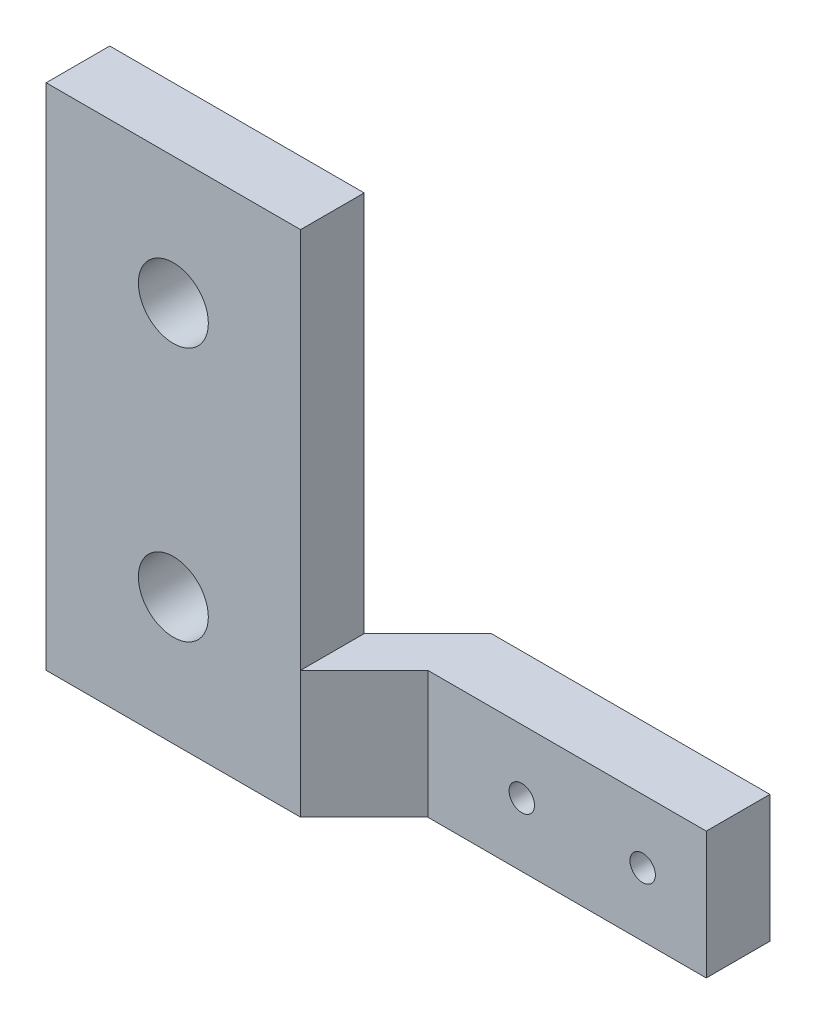
ISO-10303-21;
HEADER;
FILE_DESCRIPTION(('STEP AP214'),'2;1');
FILE_NAME('part.step','',(''),(''),'','','');
FILE_SCHEMA(('AUTOMOTIVE_DESIGN { 1 0 10303 214 1 1 1 1 }'));
ENDSEC;
DATA;
#1=APPLICATION_CONTEXT('core data for automotive mechanical design processes');
#2=APPLICATION_PROTOCOL_DEFINITION('international standard','automotive_design',2000,#1);
#3=PRODUCT_CONTEXT('',#1,'mechanical');
#4=PRODUCT('Part','Part','',(#3));
#5=PRODUCT_RELATED_PRODUCT_CATEGORY('part','',(#4));
#6=PRODUCT_DEFINITION_FORMATION('','',#4);
#7=PRODUCT_DEFINITION_CONTEXT('part definition',#1,'design');
#8=PRODUCT_DEFINITION('design','',#6,#7);
#9=PRODUCT_DEFINITION_SHAPE('','',#8);
#10=(LENGTH_UNIT() NAMED_UNIT(*) SI_UNIT(.MILLI.,.METRE.));
#11=(NAMED_UNIT(*) PLANE_ANGLE_UNIT() SI_UNIT($,.RADIAN.));
#12=(NAMED_UNIT(*) SI_UNIT($,.STERADIAN.) SOLID_ANGLE_UNIT());
#13=UNCERTAINTY_MEASURE_WITH_UNIT(LENGTH_MEASURE(1.E-05),#10,'distance_accuracy_value','');
#14=(GEOMETRIC_REPRESENTATION_CONTEXT(3) GLOBAL_UNCERTAINTY_ASSIGNED_CONTEXT((#13)) GLOBAL_UNIT_ASSIGNED_CONTEXT((#10,
#11,#12)) REPRESENTATION_CONTEXT('',''));
#15=CARTESIAN_POINT('',(0.,0.,0.));
#16=DIRECTION('',(0.,0.,1.));
#17=DIRECTION('',(1.,0.,0.));
#18=AXIS2_PLACEMENT_3D('',#15,#16,#17);
#19=CARTESIAN_POINT('',(0.,0.,5.));
#20=DIRECTION('',(0.,0.,-1.));
#21=DIRECTION('',(-1.,0.,0.));
#22=AXIS2_PLACEMENT_3D('',#19,#20,#21);
#23=PLANE('',#22);
#24=DIRECTION('',(-1.,0.,0.));
#25=VECTOR('',#24,1.);
#26=CARTESIAN_POINT('',(-37.8251466785082,16.7177277109778,5.));
#27=LINE('',#26,#25);
#28=CARTESIAN_POINT('',(-17.8251466785082,16.7177277109778,5.));
#29=VERTEX_POINT('',#28);
#30=CARTESIAN_POINT('',(-37.8251466785082,16.7177277109778,5.));
#31=VERTEX_POINT('',#30);
#32=EDGE_CURVE('E206',#29,#31,#27,.T.);
#33=ORIENTED_EDGE('',*,*,#32,.T.);
#34=DIRECTION('',(0.,-1.,0.));
#35=VECTOR('',#34,1.);
#36=CARTESIAN_POINT('',(-37.8251466785082,16.7177277109778,5.));
#37=LINE('',#36,#35);
#38=CARTESIAN_POINT('',(-37.8251466785082,-23.2822722890222,5.));
#39=VERTEX_POINT('',#38);
#40=EDGE_CURVE('E89',#31,#39,#37,.T.);
#41=ORIENTED_EDGE('',*,*,#40,.T.);
#42=DIRECTION('',(1.,0.,0.));
#43=VECTOR('',#42,1.);
#44=CARTESIAN_POINT('',(-37.8251466785082,-23.2822722890222,5.));
#45=LINE('',#44,#43);
#46=CARTESIAN_POINT('',(-17.8251466785082,-23.2822722890222,5.));
#47=VERTEX_POINT('',#46);
#48=EDGE_CURVE('E211',#39,#47,#45,.T.);
#49=ORIENTED_EDGE('',*,*,#48,.T.);
#50=DIRECTION('',(0.,1.,0.));
#51=VECTOR('',#50,1.);
#52=CARTESIAN_POINT('',(-17.8251466785082,16.7177277109778,5.));
#53=LINE('',#52,#51);
#54=CARTESIAN_POINT('',(-17.8251466785082,-13.2822722890222,5.));
#55=VERTEX_POINT('',#54);
#56=EDGE_CURVE('E215',#47,#55,#53,.T.);
#57=ORIENTED_EDGE('',*,*,#56,.T.);
#58=EDGE_CURVE('E66',#55,#29,#53,.T.);
#59=ORIENTED_EDGE('',*,*,#58,.T.);
#60=EDGE_LOOP('',(#33,#41,#49,#57,#59));
#61=FACE_BOUND('',#60,.T.);
#62=CARTESIAN_POINT('',(-27.8251466785082,6.71772771097778,5.));
#63=DIRECTION('',(0.,0.,1.));
#64=DIRECTION('',(1.,0.,0.));
#65=AXIS2_PLACEMENT_3D('',#62,#63,#64);
#66=CIRCLE('',#65,2.75);
#67=CARTESIAN_POINT('',(-25.0751466785082,6.71772771097778,5.));
#68=VERTEX_POINT('',#67);
#69=EDGE_CURVE('E198',#68,#68,#66,.T.);
#70=ORIENTED_EDGE('',*,*,#69,.F.);
#71=EDGE_LOOP('',(#70));
#72=FACE_BOUND('',#71,.T.);
#73=CARTESIAN_POINT('',(-27.8251466785082,-13.2822722890222,5.));
#74=DIRECTION('',(0.,0.,1.));
#75=DIRECTION('',(1.,0.,0.));
#76=AXIS2_PLACEMENT_3D('',#73,#74,#75);
#77=CIRCLE('',#76,2.75);
#78=CARTESIAN_POINT('',(-25.0751466785082,-13.2822722890222,5.));
#79=VERTEX_POINT('',#78);
#80=EDGE_CURVE('E190',#79,#79,#77,.T.);
#81=ORIENTED_EDGE('',*,*,#80,.F.);
#82=EDGE_LOOP('',(#81));
#83=FACE_BOUND('',#82,.T.);
#84=ADVANCED_FACE('F41',(#61,#72,#83),#23,.F.);
#85=CARTESIAN_POINT('',(0.,0.,0.));
#86=DIRECTION('',(0.,0.,-1.));
#87=DIRECTION('',(-1.,0.,0.));
#88=AXIS2_PLACEMENT_3D('',#85,#86,#87);
#89=PLANE('',#88);
#90=CARTESIAN_POINT('',(-27.8251466785082,6.71772771097778,0.));
#91=DIRECTION('',(0.,0.,1.));
#92=DIRECTION('',(1.,0.,0.));
#93=AXIS2_PLACEMENT_3D('',#90,#91,#92);
#94=CIRCLE('',#93,2.75);
#95=CARTESIAN_POINT('',(-25.0751466785082,6.71772771097778,0.));
#96=VERTEX_POINT('',#95);
#97=EDGE_CURVE('E194',#96,#96,#94,.T.);
#98=ORIENTED_EDGE('',*,*,#97,.T.);
#99=EDGE_LOOP('',(#98));
#100=FACE_BOUND('',#99,.T.);
#101=DIRECTION('',(-1.,0.,0.));
#102=VECTOR('',#101,1.);
#103=CARTESIAN_POINT('',(-37.8251466785082,16.7177277109778,0.));
#104=LINE('',#103,#102);
#105=CARTESIAN_POINT('',(-17.8251466785082,16.7177277109778,0.));
#106=VERTEX_POINT('',#105);
#107=CARTESIAN_POINT('',(-37.8251466785082,16.7177277109778,0.));
#108=VERTEX_POINT('',#107);
#109=EDGE_CURVE('E202',#106,#108,#104,.T.);
#110=ORIENTED_EDGE('',*,*,#109,.F.);
#111=DIRECTION('',(0.,1.,0.));
#112=VECTOR('',#111,1.);
#113=CARTESIAN_POINT('',(-17.8251466785082,16.7177277109778,0.));
#114=LINE('',#113,#112);
#115=CARTESIAN_POINT('',(-17.8251466785082,-13.2822722890222,0.));
#116=VERTEX_POINT('',#115);
#117=EDGE_CURVE('E84',#116,#106,#114,.T.);
#118=ORIENTED_EDGE('',*,*,#117,.F.);
#119=CARTESIAN_POINT('',(-17.8251466785082,-23.2822722890222,0.));
#120=VERTEX_POINT('',#119);
#121=EDGE_CURVE('E145',#120,#116,#114,.T.);
#122=ORIENTED_EDGE('',*,*,#121,.F.);
#123=DIRECTION('',(1.,0.,0.));
#124=VECTOR('',#123,1.);
#125=CARTESIAN_POINT('',(-37.8251466785082,-23.2822722890222,0.));
#126=LINE('',#125,#124);
#127=CARTESIAN_POINT('',(-37.8251466785082,-23.2822722890222,0.));
#128=VERTEX_POINT('',#127);
#129=EDGE_CURVE('E225',#128,#120,#126,.T.);
#130=ORIENTED_EDGE('',*,*,#129,.F.);
#131=DIRECTION('',(0.,-1.,0.));
#132=VECTOR('',#131,1.);
#133=CARTESIAN_POINT('',(-37.8251466785082,16.7177277109778,0.));
#134=LINE('',#133,#132);
#135=EDGE_CURVE('E222',#108,#128,#134,.T.);
#136=ORIENTED_EDGE('',*,*,#135,.F.);
#137=EDGE_LOOP('',(#110,#118,#122,#130,#136));
#138=FACE_BOUND('',#137,.T.);
#139=CARTESIAN_POINT('',(-27.8251466785082,-13.2822722890222,0.));
#140=DIRECTION('',(0.,0.,1.));
#141=DIRECTION('',(1.,0.,0.));
#142=AXIS2_PLACEMENT_3D('',#139,#140,#141);
#143=CIRCLE('',#142,2.75);
#144=CARTESIAN_POINT('',(-25.0751466785082,-13.2822722890222,0.));
#145=VERTEX_POINT('',#144);
#146=EDGE_CURVE('E184',#145,#145,#143,.T.);
#147=ORIENTED_EDGE('',*,*,#146,.T.);
#148=EDGE_LOOP('',(#147));
#149=FACE_BOUND('',#148,.T.);
#150=ADVANCED_FACE('F240',(#100,#138,#149),#89,.T.);
#151=CARTESIAN_POINT('',(-37.8251466785082,16.7177277109778,5.));
#152=DIRECTION('',(0.,-1.,0.));
#153=DIRECTION('',(0.,0.,-1.));
#154=AXIS2_PLACEMENT_3D('',#151,#152,#153);
#155=PLANE('',#154);
#156=ORIENTED_EDGE('',*,*,#109,.T.);
#157=DIRECTION('',(0.,0.,-1.));
#158=VECTOR('',#157,1.);
#159=CARTESIAN_POINT('',(-37.8251466785082,16.7177277109778,5.));
#160=LINE('',#159,#158);
#161=EDGE_CURVE('E11',#31,#108,#160,.T.);
#162=ORIENTED_EDGE('',*,*,#161,.F.);
#163=ORIENTED_EDGE('',*,*,#32,.F.);
#164=DIRECTION('',(0.,0.,-1.));
#165=VECTOR('',#164,1.);
#166=CARTESIAN_POINT('',(-17.8251466785082,16.7177277109778,5.));
#167=LINE('',#166,#165);
#168=EDGE_CURVE('E218',#29,#106,#167,.T.);
#169=ORIENTED_EDGE('',*,*,#168,.T.);
#170=EDGE_LOOP('',(#156,#162,#163,#169));
#171=FACE_BOUND('',#170,.T.);
#172=ADVANCED_FACE('F43',(#171),#155,.F.);
#173=CARTESIAN_POINT('',(-37.8251466785082,16.7177277109778,5.));
#174=DIRECTION('',(1.,0.,0.));
#175=DIRECTION('',(0.,0.,-1.));
#176=AXIS2_PLACEMENT_3D('',#173,#174,#175);
#177=PLANE('',#176);
#178=ORIENTED_EDGE('',*,*,#135,.T.);
#179=DIRECTION('',(0.,0.,-1.));
#180=VECTOR('',#179,1.);
#181=CARTESIAN_POINT('',(-37.8251466785082,-23.2822722890222,5.));
#182=LINE('',#181,#180);
#183=EDGE_CURVE('E50',#39,#128,#182,.T.);
#184=ORIENTED_EDGE('',*,*,#183,.F.);
#185=ORIENTED_EDGE('',*,*,#40,.F.);
#186=ORIENTED_EDGE('',*,*,#161,.T.);
#187=EDGE_LOOP('',(#178,#184,#185,#186));
#188=FACE_BOUND('',#187,.T.);
#189=ADVANCED_FACE('F283',(#188),#177,.F.);
#190=CARTESIAN_POINT('',(-37.8251466785082,-23.2822722890222,5.));
#191=DIRECTION('',(0.,1.,0.));
#192=DIRECTION('',(0.,0.,1.));
#193=AXIS2_PLACEMENT_3D('',#190,#191,#192);
#194=PLANE('',#193);
#195=ORIENTED_EDGE('',*,*,#129,.T.);
#196=DIRECTION('',(0.707106781186544,0.,-0.707106781186551));
#197=VECTOR('',#196,1.);
#198=CARTESIAN_POINT('',(-12.8251466785082,-23.2822722890222,-5.));
#199=LINE('',#198,#197);
#200=CARTESIAN_POINT('',(-12.8251466785082,-23.2822722890222,-5.));
#201=VERTEX_POINT('',#200);
#202=EDGE_CURVE('E168',#120,#201,#199,.T.);
#203=ORIENTED_EDGE('',*,*,#202,.T.);
#204=DIRECTION('',(1.,0.,0.));
#205=VECTOR('',#204,1.);
#206=CARTESIAN_POINT('',(9.06312819772061,-23.2822722890222,-4.99999999999999));
#207=LINE('',#206,#205);
#208=CARTESIAN_POINT('',(9.06312819772061,-23.2822722890222,-4.99999999999999));
#209=VERTEX_POINT('',#208);
#210=EDGE_CURVE('E129',#201,#209,#207,.T.);
#211=ORIENTED_EDGE('',*,*,#210,.T.);
#212=DIRECTION('',(0.,0.,1.));
#213=VECTOR('',#212,1.);
#214=CARTESIAN_POINT('',(9.06312819772061,-23.2822722890222,0.));
#215=LINE('',#214,#213);
#216=CARTESIAN_POINT('',(9.06312819772061,-23.2822722890222,0.));
#217=VERTEX_POINT('',#216);
#218=EDGE_CURVE('E174',#209,#217,#215,.T.);
#219=ORIENTED_EDGE('',*,*,#218,.T.);
#220=DIRECTION('',(-1.,0.,0.));
#221=VECTOR('',#220,1.);
#222=CARTESIAN_POINT('',(-12.8251466785082,-23.2822722890222,0.));
#223=LINE('',#222,#221);
#224=CARTESIAN_POINT('',(-12.8251466785082,-23.2822722890222,0.));
#225=VERTEX_POINT('',#224);
#226=EDGE_CURVE('E151',#217,#225,#223,.T.);
#227=ORIENTED_EDGE('',*,*,#226,.T.);
#228=DIRECTION('',(-0.707106781186544,0.,0.707106781186551));
#229=VECTOR('',#228,1.);
#230=CARTESIAN_POINT('',(-17.8251466785082,-23.2822722890222,5.));
#231=LINE('',#230,#229);
#232=EDGE_CURVE('E147',#225,#47,#231,.T.);
#233=ORIENTED_EDGE('',*,*,#232,.T.);
#234=ORIENTED_EDGE('',*,*,#48,.F.);
#235=ORIENTED_EDGE('',*,*,#183,.T.);
#236=EDGE_LOOP('',(#195,#203,#211,#219,#227,#233,#234,#235));
#237=FACE_BOUND('',#236,.T.);
#238=ADVANCED_FACE('F237',(#237),#194,.F.);
#239=CARTESIAN_POINT('',(-17.8251466785082,16.7177277109778,5.));
#240=DIRECTION('',(-1.,0.,0.));
#241=DIRECTION('',(0.,-1.,0.));
#242=AXIS2_PLACEMENT_3D('',#239,#240,#241);
#243=PLANE('',#242);
#244=ORIENTED_EDGE('',*,*,#58,.F.);
#245=DIRECTION('',(0.,0.,-1.));
#246=VECTOR('',#245,1.);
#247=CARTESIAN_POINT('',(-17.8251466785082,-13.2822722890222,0.));
#248=LINE('',#247,#246);
#249=EDGE_CURVE('E134',#55,#116,#248,.T.);
#250=ORIENTED_EDGE('',*,*,#249,.T.);
#251=ORIENTED_EDGE('',*,*,#117,.T.);
#252=ORIENTED_EDGE('',*,*,#168,.F.);
#253=EDGE_LOOP('',(#244,#250,#251,#252));
#254=FACE_BOUND('',#253,.T.);
#255=ADVANCED_FACE('F247',(#254),#243,.F.);
#256=CARTESIAN_POINT('',(-27.8251466785082,6.71772771097778,5.));
#257=DIRECTION('',(0.,0.,-1.));
#258=DIRECTION('',(-1.,0.,0.));
#259=AXIS2_PLACEMENT_3D('',#256,#257,#258);
#260=CYLINDRICAL_SURFACE('',#259,2.75);
#261=ORIENTED_EDGE('',*,*,#69,.T.);
#262=EDGE_LOOP('',(#261));
#263=FACE_BOUND('',#262,.T.);
#264=ORIENTED_EDGE('',*,*,#97,.F.);
#265=EDGE_LOOP('',(#264));
#266=FACE_BOUND('',#265,.T.);
#267=ADVANCED_FACE('F277',(#263,#266),#260,.F.);
#268=CARTESIAN_POINT('',(-27.8251466785082,-13.2822722890222,5.));
#269=DIRECTION('',(0.,0.,-1.));
#270=DIRECTION('',(-1.,0.,0.));
#271=AXIS2_PLACEMENT_3D('',#268,#269,#270);
#272=CYLINDRICAL_SURFACE('',#271,2.75);
#273=ORIENTED_EDGE('',*,*,#80,.T.);
#274=EDGE_LOOP('',(#273));
#275=FACE_BOUND('',#274,.T.);
#276=ORIENTED_EDGE('',*,*,#146,.F.);
#277=EDGE_LOOP('',(#276));
#278=FACE_BOUND('',#277,.T.);
#279=ADVANCED_FACE('F322',(#275,#278),#272,.F.);
#280=CARTESIAN_POINT('',(-12.8251466785082,-13.2822722890222,-5.));
#281=DIRECTION('',(-0.707106781186551,0.,-0.707106781186544));
#282=DIRECTION('',(-0.707106781186544,0.,0.707106781186551));
#283=AXIS2_PLACEMENT_3D('',#280,#281,#282);
#284=PLANE('',#283);
#285=ORIENTED_EDGE('',*,*,#202,.F.);
#286=ORIENTED_EDGE('',*,*,#121,.T.);
#287=DIRECTION('',(0.707106781186544,0.,-0.707106781186551));
#288=VECTOR('',#287,1.);
#289=CARTESIAN_POINT('',(-12.8251466785082,-13.2822722890222,-5.));
#290=LINE('',#289,#288);
#291=CARTESIAN_POINT('',(-12.8251466785082,-13.2822722890222,-5.));
#292=VERTEX_POINT('',#291);
#293=EDGE_CURVE('E57',#116,#292,#290,.T.);
#294=ORIENTED_EDGE('',*,*,#293,.T.);
#295=DIRECTION('',(0.,-1.,0.));
#296=VECTOR('',#295,1.);
#297=CARTESIAN_POINT('',(-12.8251466785082,-13.2822722890222,-5.));
#298=LINE('',#297,#296);
#299=EDGE_CURVE('E125',#292,#201,#298,.T.);
#300=ORIENTED_EDGE('',*,*,#299,.T.);
#301=EDGE_LOOP('',(#285,#286,#294,#300));
#302=FACE_BOUND('',#301,.T.);
#303=ADVANCED_FACE('F143',(#302),#284,.T.);
#304=CARTESIAN_POINT('',(-17.8251466785082,-13.2822722890222,5.));
#305=DIRECTION('',(0.707106781186551,0.,0.707106781186544));
#306=DIRECTION('',(0.707106781186544,0.,-0.707106781186551));
#307=AXIS2_PLACEMENT_3D('',#304,#305,#306);
#308=PLANE('',#307);
#309=ORIENTED_EDGE('',*,*,#232,.F.);
#310=DIRECTION('',(0.,-1.,0.));
#311=VECTOR('',#310,1.);
#312=CARTESIAN_POINT('',(-12.8251466785082,-13.2822722890222,0.));
#313=LINE('',#312,#311);
#314=CARTESIAN_POINT('',(-12.8251466785082,-13.2822722890222,0.));
#315=VERTEX_POINT('',#314);
#316=EDGE_CURVE('E181',#315,#225,#313,.T.);
#317=ORIENTED_EDGE('',*,*,#316,.F.);
#318=DIRECTION('',(-0.707106781186544,0.,0.707106781186551));
#319=VECTOR('',#318,1.);
#320=CARTESIAN_POINT('',(-17.8251466785082,-13.2822722890222,5.));
#321=LINE('',#320,#319);
#322=EDGE_CURVE('E163',#315,#55,#321,.T.);
#323=ORIENTED_EDGE('',*,*,#322,.T.);
#324=ORIENTED_EDGE('',*,*,#56,.F.);
#325=EDGE_LOOP('',(#309,#317,#323,#324));
#326=FACE_BOUND('',#325,.T.);
#327=ADVANCED_FACE('F251',(#326),#308,.T.);
#328=CARTESIAN_POINT('',(-12.8251466785082,-13.2822722890222,0.));
#329=DIRECTION('',(0.,0.,1.));
#330=DIRECTION('',(1.,0.,0.));
#331=AXIS2_PLACEMENT_3D('',#328,#329,#330);
#332=PLANE('',#331);
#333=CARTESIAN_POINT('',(4.06312819772064,-18.2822722890222,0.));
#334=DIRECTION('',(0.,0.,1.));
#335=DIRECTION('',(1.,0.,0.));
#336=AXIS2_PLACEMENT_3D('',#333,#334,#335);
#337=CIRCLE('',#336,1.);
#338=CARTESIAN_POINT('',(5.06312819772064,-18.2822722890222,0.));
#339=VERTEX_POINT('',#338);
#340=EDGE_CURVE('E171',#339,#339,#337,.T.);
#341=ORIENTED_EDGE('',*,*,#340,.F.);
#342=EDGE_LOOP('',(#341));
#343=FACE_BOUND('',#342,.T.);
#344=CARTESIAN_POINT('',(-5.43687180227936,-18.2822722890222,0.));
#345=DIRECTION('',(0.,0.,1.));
#346=DIRECTION('',(1.,0.,0.));
#347=AXIS2_PLACEMENT_3D('',#344,#345,#346);
#348=CIRCLE('',#347,1.);
#349=CARTESIAN_POINT('',(-4.43687180227936,-18.2822722890222,0.));
#350=VERTEX_POINT('',#349);
#351=EDGE_CURVE('E388',#350,#350,#348,.T.);
#352=ORIENTED_EDGE('',*,*,#351,.F.);
#353=EDGE_LOOP('',(#352));
#354=FACE_BOUND('',#353,.T.);
#355=ORIENTED_EDGE('',*,*,#226,.F.);
#356=DIRECTION('',(0.,-1.,0.));
#357=VECTOR('',#356,1.);
#358=CARTESIAN_POINT('',(9.06312819772061,-13.2822722890222,0.));
#359=LINE('',#358,#357);
#360=CARTESIAN_POINT('',(9.06312819772061,-13.2822722890222,0.));
#361=VERTEX_POINT('',#360);
#362=EDGE_CURVE('E185',#361,#217,#359,.T.);
#363=ORIENTED_EDGE('',*,*,#362,.F.);
#364=DIRECTION('',(-1.,0.,0.));
#365=VECTOR('',#364,1.);
#366=CARTESIAN_POINT('',(-12.8251466785082,-13.2822722890222,0.));
#367=LINE('',#366,#365);
#368=EDGE_CURVE('E159',#361,#315,#367,.T.);
#369=ORIENTED_EDGE('',*,*,#368,.T.);
#370=ORIENTED_EDGE('',*,*,#316,.T.);
#371=EDGE_LOOP('',(#355,#363,#369,#370));
#372=FACE_BOUND('',#371,.T.);
#373=ADVANCED_FACE('F256',(#343,#354,#372),#332,.T.);
#374=CARTESIAN_POINT('',(9.06312819772061,-13.2822722890222,0.));
#375=DIRECTION('',(1.,0.,0.));
#376=DIRECTION('',(0.,0.,-1.));
#377=AXIS2_PLACEMENT_3D('',#374,#375,#376);
#378=PLANE('',#377);
#379=ORIENTED_EDGE('',*,*,#218,.F.);
#380=DIRECTION('',(0.,-1.,0.));
#381=VECTOR('',#380,1.);
#382=CARTESIAN_POINT('',(9.06312819772061,-13.2822722890222,-4.99999999999999));
#383=LINE('',#382,#381);
#384=CARTESIAN_POINT('',(9.06312819772061,-13.2822722890222,-4.99999999999999));
#385=VERTEX_POINT('',#384);
#386=EDGE_CURVE('E133',#385,#209,#383,.T.);
#387=ORIENTED_EDGE('',*,*,#386,.F.);
#388=DIRECTION('',(0.,0.,1.));
#389=VECTOR('',#388,1.);
#390=CARTESIAN_POINT('',(9.06312819772061,-13.2822722890222,0.));
#391=LINE('',#390,#389);
#392=EDGE_CURVE('E140',#385,#361,#391,.T.);
#393=ORIENTED_EDGE('',*,*,#392,.T.);
#394=ORIENTED_EDGE('',*,*,#362,.T.);
#395=EDGE_LOOP('',(#379,#387,#393,#394));
#396=FACE_BOUND('',#395,.T.);
#397=ADVANCED_FACE('F258',(#396),#378,.T.);
#398=CARTESIAN_POINT('',(9.06312819772061,-13.2822722890222,-4.99999999999999));
#399=DIRECTION('',(0.,0.,-1.));
#400=DIRECTION('',(-1.,0.,0.));
#401=AXIS2_PLACEMENT_3D('',#398,#399,#400);
#402=PLANE('',#401);
#403=CARTESIAN_POINT('',(4.06312819772064,-18.2822722890222,-4.99999999999999));
#404=DIRECTION('',(0.,0.,-1.));
#405=DIRECTION('',(-1.,0.,0.));
#406=AXIS2_PLACEMENT_3D('',#403,#404,#405);
#407=CIRCLE('',#406,1.);
#408=CARTESIAN_POINT('',(5.06312819772064,-18.2822722890222,-4.99999999999999));
#409=VERTEX_POINT('',#408);
#410=EDGE_CURVE('E382',#409,#409,#407,.F.);
#411=ORIENTED_EDGE('',*,*,#410,.T.);
#412=EDGE_LOOP('',(#411));
#413=FACE_BOUND('',#412,.T.);
#414=CARTESIAN_POINT('',(-5.43687180227936,-18.2822722890222,-4.99999999999999));
#415=DIRECTION('',(0.,0.,-1.));
#416=DIRECTION('',(-1.,0.,0.));
#417=AXIS2_PLACEMENT_3D('',#414,#415,#416);
#418=CIRCLE('',#417,1.);
#419=CARTESIAN_POINT('',(-4.43687180227936,-18.2822722890222,-4.99999999999999));
#420=VERTEX_POINT('',#419);
#421=EDGE_CURVE('E154',#420,#420,#418,.F.);
#422=ORIENTED_EDGE('',*,*,#421,.T.);
#423=EDGE_LOOP('',(#422));
#424=FACE_BOUND('',#423,.T.);
#425=ORIENTED_EDGE('',*,*,#210,.F.);
#426=ORIENTED_EDGE('',*,*,#299,.F.);
#427=DIRECTION('',(1.,0.,0.));
#428=VECTOR('',#427,1.);
#429=CARTESIAN_POINT('',(9.06312819772061,-13.2822722890222,-4.99999999999999));
#430=LINE('',#429,#428);
#431=EDGE_CURVE('E127',#292,#385,#430,.T.);
#432=ORIENTED_EDGE('',*,*,#431,.T.);
#433=ORIENTED_EDGE('',*,*,#386,.T.);
#434=EDGE_LOOP('',(#425,#426,#432,#433));
#435=FACE_BOUND('',#434,.T.);
#436=ADVANCED_FACE('F126',(#413,#424,#435),#402,.T.);
#437=CARTESIAN_POINT('',(0.,-13.2822722890222,0.));
#438=DIRECTION('',(0.,1.,0.));
#439=DIRECTION('',(0.,0.,1.));
#440=AXIS2_PLACEMENT_3D('',#437,#438,#439);
#441=PLANE('',#440);
#442=ORIENTED_EDGE('',*,*,#293,.F.);
#443=ORIENTED_EDGE('',*,*,#249,.F.);
#444=ORIENTED_EDGE('',*,*,#322,.F.);
#445=ORIENTED_EDGE('',*,*,#368,.F.);
#446=ORIENTED_EDGE('',*,*,#392,.F.);
#447=ORIENTED_EDGE('',*,*,#431,.F.);
#448=EDGE_LOOP('',(#442,#443,#444,#445,#446,#447));
#449=FACE_BOUND('',#448,.T.);
#450=ADVANCED_FACE('F137',(#449),#441,.T.);
#451=CARTESIAN_POINT('',(-5.43687180227936,-18.2822722890222,-5.001));
#452=DIRECTION('',(0.,0.,1.));
#453=DIRECTION('',(1.,0.,0.));
#454=AXIS2_PLACEMENT_3D('',#451,#452,#453);
#455=CYLINDRICAL_SURFACE('',#454,1.);
#456=CARTESIAN_POINT('',(-4.43687180227936,-18.2822722890222,-4.99999999999999));
#457=CARTESIAN_POINT('',(-4.43687180227936,-18.2822722890222,-4.94791666666666));
#458=CARTESIAN_POINT('',(-4.43687180227936,-18.2822722890222,-4.89583333333333));
#459=CARTESIAN_POINT('',(-4.43687180227936,-18.2822722890222,-4.79166666666666));
#460=CARTESIAN_POINT('',(-4.43687180227936,-18.2822722890222,-4.73958333333333));
#461=CARTESIAN_POINT('',(-4.43687180227936,-18.2822722890222,-4.63541666666666));
#462=CARTESIAN_POINT('',(-4.43687180227936,-18.2822722890222,-4.58333333333333));
#463=CARTESIAN_POINT('',(-4.43687180227936,-18.2822722890222,-4.47916666666666));
#464=CARTESIAN_POINT('',(-4.43687180227936,-18.2822722890222,-4.42708333333333));
#465=CARTESIAN_POINT('',(-4.43687180227936,-18.2822722890222,-4.32291666666666));
#466=CARTESIAN_POINT('',(-4.43687180227936,-18.2822722890222,-4.27083333333333));
#467=CARTESIAN_POINT('',(-4.43687180227936,-18.2822722890222,-4.16666666666666));
#468=CARTESIAN_POINT('',(-4.43687180227936,-18.2822722890222,-4.11458333333333));
#469=CARTESIAN_POINT('',(-4.43687180227936,-18.2822722890222,-4.01041666666666));
#470=CARTESIAN_POINT('',(-4.43687180227936,-18.2822722890222,-3.95833333333333));
#471=CARTESIAN_POINT('',(-4.43687180227936,-18.2822722890222,-3.85416666666666));
#472=CARTESIAN_POINT('',(-4.43687180227936,-18.2822722890222,-3.80208333333333));
#473=CARTESIAN_POINT('',(-4.43687180227936,-18.2822722890222,-3.69791666666666));
#474=CARTESIAN_POINT('',(-4.43687180227936,-18.2822722890222,-3.64583333333333));
#475=CARTESIAN_POINT('',(-4.43687180227936,-18.2822722890222,-3.54166666666666));
#476=CARTESIAN_POINT('',(-4.43687180227936,-18.2822722890222,-3.48958333333333));
#477=CARTESIAN_POINT('',(-4.43687180227936,-18.2822722890222,-3.38541666666666));
#478=CARTESIAN_POINT('',(-4.43687180227936,-18.2822722890222,-3.33333333333333));
#479=CARTESIAN_POINT('',(-4.43687180227936,-18.2822722890222,-3.22916666666666));
#480=CARTESIAN_POINT('',(-4.43687180227936,-18.2822722890222,-3.17708333333333));
#481=CARTESIAN_POINT('',(-4.43687180227936,-18.2822722890222,-3.07291666666666));
#482=CARTESIAN_POINT('',(-4.43687180227936,-18.2822722890222,-3.02083333333333));
#483=CARTESIAN_POINT('',(-4.43687180227936,-18.2822722890222,-2.91666666666666));
#484=CARTESIAN_POINT('',(-4.43687180227936,-18.2822722890222,-2.86458333333333));
#485=CARTESIAN_POINT('',(-4.43687180227936,-18.2822722890222,-2.76041666666666));
#486=CARTESIAN_POINT('',(-4.43687180227936,-18.2822722890222,-2.70833333333333));
#487=CARTESIAN_POINT('',(-4.43687180227936,-18.2822722890222,-2.60416666666666));
#488=CARTESIAN_POINT('',(-4.43687180227936,-18.2822722890222,-2.55208333333333));
#489=CARTESIAN_POINT('',(-4.43687180227936,-18.2822722890222,-2.44791666666666));
#490=CARTESIAN_POINT('',(-4.43687180227936,-18.2822722890222,-2.39583333333333));
#491=CARTESIAN_POINT('',(-4.43687180227936,-18.2822722890222,-2.29166666666666));
#492=CARTESIAN_POINT('',(-4.43687180227936,-18.2822722890222,-2.23958333333333));
#493=CARTESIAN_POINT('',(-4.43687180227936,-18.2822722890222,-2.13541666666666));
#494=CARTESIAN_POINT('',(-4.43687180227936,-18.2822722890222,-2.08333333333333));
#495=CARTESIAN_POINT('',(-4.43687180227936,-18.2822722890222,-1.97916666666666));
#496=CARTESIAN_POINT('',(-4.43687180227936,-18.2822722890222,-1.92708333333333));
#497=CARTESIAN_POINT('',(-4.43687180227936,-18.2822722890222,-1.82291666666666));
#498=CARTESIAN_POINT('',(-4.43687180227936,-18.2822722890222,-1.77083333333333));
#499=CARTESIAN_POINT('',(-4.43687180227936,-18.2822722890222,-1.66666666666666));
#500=CARTESIAN_POINT('',(-4.43687180227936,-18.2822722890222,-1.61458333333333));
#501=CARTESIAN_POINT('',(-4.43687180227936,-18.2822722890222,-1.51041666666666));
#502=CARTESIAN_POINT('',(-4.43687180227936,-18.2822722890222,-1.45833333333333));
#503=CARTESIAN_POINT('',(-4.43687180227936,-18.2822722890222,-1.35416666666666));
#504=CARTESIAN_POINT('',(-4.43687180227936,-18.2822722890222,-1.30208333333333));
#505=CARTESIAN_POINT('',(-4.43687180227936,-18.2822722890222,-1.19791666666666));
#506=CARTESIAN_POINT('',(-4.43687180227936,-18.2822722890222,-1.14583333333333));
#507=CARTESIAN_POINT('',(-4.43687180227936,-18.2822722890222,-1.04166666666667));
#508=CARTESIAN_POINT('',(-4.43687180227936,-18.2822722890222,-0.989583333333333));
#509=CARTESIAN_POINT('',(-4.43687180227936,-18.2822722890222,-0.885416666666666));
#510=CARTESIAN_POINT('',(-4.43687180227936,-18.2822722890222,-0.833333333333332));
#511=CARTESIAN_POINT('',(-4.43687180227936,-18.2822722890222,-0.729166666666666));
#512=CARTESIAN_POINT('',(-4.43687180227936,-18.2822722890222,-0.677083333333332));
#513=CARTESIAN_POINT('',(-4.43687180227936,-18.2822722890222,-0.572916666666666));
#514=CARTESIAN_POINT('',(-4.43687180227936,-18.2822722890222,-0.520833333333332));
#515=CARTESIAN_POINT('',(-4.43687180227936,-18.2822722890222,-0.416666666666665));
#516=CARTESIAN_POINT('',(-4.43687180227936,-18.2822722890222,-0.364583333333332));
#517=CARTESIAN_POINT('',(-4.43687180227936,-18.2822722890222,-0.260416666666666));
#518=CARTESIAN_POINT('',(-4.43687180227936,-18.2822722890222,-0.208333333333333));
#519=CARTESIAN_POINT('',(-4.43687180227936,-18.2822722890222,-0.104166666666667));
#520=CARTESIAN_POINT('',(-4.43687180227936,-18.2822722890222,-0.0520833333333333));
#521=CARTESIAN_POINT('',(-4.43687180227936,-18.2822722890222,0.));
#522=B_SPLINE_CURVE_WITH_KNOTS('',3,(#456,#457,#458,#459,#460,#461,#462,#463,#464,#465,#466,
#467,#468,#469,#470,#471,#472,#473,#474,#475,#476,#477,#478,#479,#480,#481,#482,#483,#484,#485,
#486,#487,#488,#489,#490,#491,#492,#493,#494,#495,#496,#497,#498,#499,#500,#501,#502,#503,#504,
#505,#506,#507,#508,#509,#510,#511,#512,#513,#514,#515,#516,#517,#518,#519,#520,#521),
.UNSPECIFIED.,.F.,.F.,(4,2,2,2,2,2,2,2,2,2,2,2,2,2,2,2,2,2,2,2,2,2,2,2,2,2,2,2,2,2,2,2,4),(0.,
0.15625,0.3125,0.46875,0.625,0.78125,0.9375,1.09375,1.25,1.40625,1.5625,1.71875,1.875,2.03125,
2.1875,2.34375,2.5,2.65625,2.8125,2.96875,3.125,3.28125,3.4375,3.59375,3.75,3.90625,4.0625,
4.21875,4.375,4.53125,4.6875,4.84374999999999,4.99999999999999),.UNSPECIFIED.);
#523=EDGE_CURVE('BSEAM346',#420,#350,#522,.T.);
#524=ORIENTED_EDGE('',*,*,#421,.F.);
#525=ORIENTED_EDGE('',*,*,#351,.T.);
#526=ORIENTED_EDGE('',*,*,#523,.T.);
#527=ORIENTED_EDGE('',*,*,#523,.F.);
#528=EDGE_LOOP('',(#524,#526,#525,#527));
#529=FACE_BOUND('',#528,.T.);
#530=ADVANCED_FACE('F346',(#529),#455,.F.);
#531=CARTESIAN_POINT('',(4.06312819772064,-18.2822722890222,-5.001));
#532=DIRECTION('',(0.,0.,1.));
#533=DIRECTION('',(1.,0.,0.));
#534=AXIS2_PLACEMENT_3D('',#531,#532,#533);
#535=CYLINDRICAL_SURFACE('',#534,1.);
#536=CARTESIAN_POINT('',(5.06312819772064,-18.2822722890222,-4.99999999999999));
#537=CARTESIAN_POINT('',(5.06312819772064,-18.2822722890222,-4.94791666666666));
#538=CARTESIAN_POINT('',(5.06312819772064,-18.2822722890222,-4.89583333333333));
#539=CARTESIAN_POINT('',(5.06312819772064,-18.2822722890222,-4.79166666666666));
#540=CARTESIAN_POINT('',(5.06312819772064,-18.2822722890222,-4.73958333333333));
#541=CARTESIAN_POINT('',(5.06312819772064,-18.2822722890222,-4.63541666666666));
#542=CARTESIAN_POINT('',(5.06312819772064,-18.2822722890222,-4.58333333333333));
#543=CARTESIAN_POINT('',(5.06312819772064,-18.2822722890222,-4.47916666666666));
#544=CARTESIAN_POINT('',(5.06312819772064,-18.2822722890222,-4.42708333333333));
#545=CARTESIAN_POINT('',(5.06312819772064,-18.2822722890222,-4.32291666666666));
#546=CARTESIAN_POINT('',(5.06312819772064,-18.2822722890222,-4.27083333333333));
#547=CARTESIAN_POINT('',(5.06312819772064,-18.2822722890222,-4.16666666666666));
#548=CARTESIAN_POINT('',(5.06312819772064,-18.2822722890222,-4.11458333333333));
#549=CARTESIAN_POINT('',(5.06312819772064,-18.2822722890222,-4.01041666666666));
#550=CARTESIAN_POINT('',(5.06312819772064,-18.2822722890222,-3.95833333333333));
#551=CARTESIAN_POINT('',(5.06312819772064,-18.2822722890222,-3.85416666666666));
#552=CARTESIAN_POINT('',(5.06312819772064,-18.2822722890222,-3.80208333333333));
#553=CARTESIAN_POINT('',(5.06312819772064,-18.2822722890222,-3.69791666666666));
#554=CARTESIAN_POINT('',(5.06312819772064,-18.2822722890222,-3.64583333333333));
#555=CARTESIAN_POINT('',(5.06312819772064,-18.2822722890222,-3.54166666666666));
#556=CARTESIAN_POINT('',(5.06312819772064,-18.2822722890222,-3.48958333333333));
#557=CARTESIAN_POINT('',(5.06312819772064,-18.2822722890222,-3.38541666666666));
#558=CARTESIAN_POINT('',(5.06312819772064,-18.2822722890222,-3.33333333333333));
#559=CARTESIAN_POINT('',(5.06312819772064,-18.2822722890222,-3.22916666666666));
#560=CARTESIAN_POINT('',(5.06312819772064,-18.2822722890222,-3.17708333333333));
#561=CARTESIAN_POINT('',(5.06312819772064,-18.2822722890222,-3.07291666666666));
#562=CARTESIAN_POINT('',(5.06312819772064,-18.2822722890222,-3.02083333333333));
#563=CARTESIAN_POINT('',(5.06312819772064,-18.2822722890222,-2.91666666666666));
#564=CARTESIAN_POINT('',(5.06312819772064,-18.2822722890222,-2.86458333333333));
#565=CARTESIAN_POINT('',(5.06312819772064,-18.2822722890222,-2.76041666666666));
#566=CARTESIAN_POINT('',(5.06312819772064,-18.2822722890222,-2.70833333333333));
#567=CARTESIAN_POINT('',(5.06312819772064,-18.2822722890222,-2.60416666666666));
#568=CARTESIAN_POINT('',(5.06312819772064,-18.2822722890222,-2.55208333333333));
#569=CARTESIAN_POINT('',(5.06312819772064,-18.2822722890222,-2.44791666666666));
#570=CARTESIAN_POINT('',(5.06312819772064,-18.2822722890222,-2.39583333333333));
#571=CARTESIAN_POINT('',(5.06312819772064,-18.2822722890222,-2.29166666666666));
#572=CARTESIAN_POINT('',(5.06312819772064,-18.2822722890222,-2.23958333333333));
#573=CARTESIAN_POINT('',(5.06312819772064,-18.2822722890222,-2.13541666666666));
#574=CARTESIAN_POINT('',(5.06312819772064,-18.2822722890222,-2.08333333333333));
#575=CARTESIAN_POINT('',(5.06312819772064,-18.2822722890222,-1.97916666666666));
#576=CARTESIAN_POINT('',(5.06312819772064,-18.2822722890222,-1.92708333333333));
#577=CARTESIAN_POINT('',(5.06312819772064,-18.2822722890222,-1.82291666666666));
#578=CARTESIAN_POINT('',(5.06312819772064,-18.2822722890222,-1.77083333333333));
#579=CARTESIAN_POINT('',(5.06312819772064,-18.2822722890222,-1.66666666666666));
#580=CARTESIAN_POINT('',(5.06312819772064,-18.2822722890222,-1.61458333333333));
#581=CARTESIAN_POINT('',(5.06312819772064,-18.2822722890222,-1.51041666666666));
#582=CARTESIAN_POINT('',(5.06312819772064,-18.2822722890222,-1.45833333333333));
#583=CARTESIAN_POINT('',(5.06312819772064,-18.2822722890222,-1.35416666666666));
#584=CARTESIAN_POINT('',(5.06312819772064,-18.2822722890222,-1.30208333333333));
#585=CARTESIAN_POINT('',(5.06312819772064,-18.2822722890222,-1.19791666666666));
#586=CARTESIAN_POINT('',(5.06312819772064,-18.2822722890222,-1.14583333333333));
#587=CARTESIAN_POINT('',(5.06312819772064,-18.2822722890222,-1.04166666666667));
#588=CARTESIAN_POINT('',(5.06312819772064,-18.2822722890222,-0.989583333333332));
#589=CARTESIAN_POINT('',(5.06312819772064,-18.2822722890222,-0.885416666666666));
#590=CARTESIAN_POINT('',(5.06312819772064,-18.2822722890222,-0.833333333333332));
#591=CARTESIAN_POINT('',(5.06312819772064,-18.2822722890222,-0.729166666666666));
#592=CARTESIAN_POINT('',(5.06312819772064,-18.2822722890222,-0.677083333333332));
#593=CARTESIAN_POINT('',(5.06312819772064,-18.2822722890222,-0.572916666666666));
#594=CARTESIAN_POINT('',(5.06312819772064,-18.2822722890222,-0.520833333333332));
#595=CARTESIAN_POINT('',(5.06312819772064,-18.2822722890222,-0.416666666666665));
#596=CARTESIAN_POINT('',(5.06312819772064,-18.2822722890222,-0.364583333333332));
#597=CARTESIAN_POINT('',(5.06312819772064,-18.2822722890222,-0.260416666666666));
#598=CARTESIAN_POINT('',(5.06312819772064,-18.2822722890222,-0.208333333333333));
#599=CARTESIAN_POINT('',(5.06312819772064,-18.2822722890222,-0.104166666666667));
#600=CARTESIAN_POINT('',(5.06312819772064,-18.2822722890222,-0.0520833333333333));
#601=CARTESIAN_POINT('',(5.06312819772064,-18.2822722890222,0.));
#602=B_SPLINE_CURVE_WITH_KNOTS('',3,(#536,#537,#538,#539,#540,#541,#542,#543,#544,#545,#546,
#547,#548,#549,#550,#551,#552,#553,#554,#555,#556,#557,#558,#559,#560,#561,#562,#563,#564,#565,
#566,#567,#568,#569,#570,#571,#572,#573,#574,#575,#576,#577,#578,#579,#580,#581,#582,#583,#584,
#585,#586,#587,#588,#589,#590,#591,#592,#593,#594,#595,#596,#597,#598,#599,#600,#601),
.UNSPECIFIED.,.F.,.F.,(4,2,2,2,2,2,2,2,2,2,2,2,2,2,2,2,2,2,2,2,2,2,2,2,2,2,2,2,2,2,2,2,4),(0.,
0.15625,0.3125,0.46875,0.625,0.78125,0.937499999999999,1.09375,1.25,1.40625,1.5625,1.71875,
1.875,2.03125,2.1875,2.34375,2.5,2.65625,2.8125,2.96875,3.125,3.28125,3.4375,3.59375,3.75,
3.90624999999999,4.06249999999999,4.21874999999999,4.37499999999999,4.53124999999999,
4.68749999999999,4.84374999999999,4.99999999999999),.UNSPECIFIED.);
#603=EDGE_CURVE('BSEAM365',#409,#339,#602,.T.);
#604=ORIENTED_EDGE('',*,*,#410,.F.);
#605=ORIENTED_EDGE('',*,*,#340,.T.);
#606=ORIENTED_EDGE('',*,*,#603,.T.);
#607=ORIENTED_EDGE('',*,*,#603,.F.);
#608=EDGE_LOOP('',(#604,#606,#605,#607));
#609=FACE_BOUND('',#608,.T.);
#610=ADVANCED_FACE('F365',(#609),#535,.F.);
#611=CLOSED_SHELL('',(#84,#150,#172,#189,#238,#255,#267,#279,#303,#327,#373,#397,#436,#450,#530,#610));
#612=MANIFOLD_SOLID_BREP('B2',#611);
#613=ADVANCED_BREP_SHAPE_REPRESENTATION('',(#18,#612),#14);
#614=SHAPE_DEFINITION_REPRESENTATION(#9,#613);
ENDSEC;
END-ISO-10303-21;
